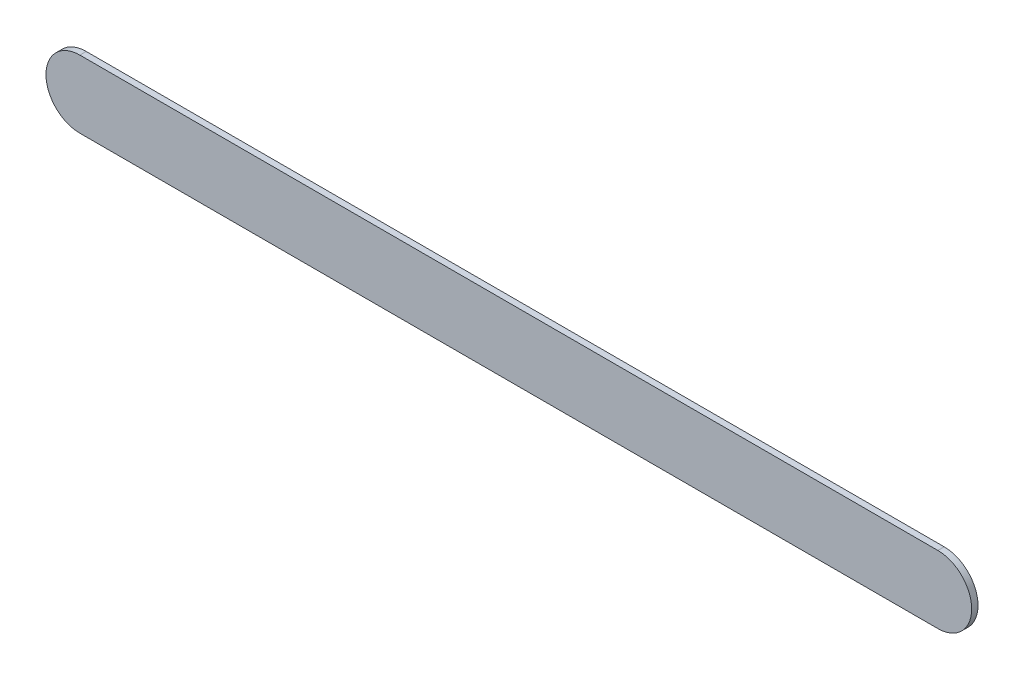
ISO-10303-21;
HEADER;
FILE_DESCRIPTION(('STEP AP214'),'2;1');
FILE_NAME('part.step','',(''),(''),'','','');
FILE_SCHEMA(('AUTOMOTIVE_DESIGN { 1 0 10303 214 1 1 1 1 }'));
ENDSEC;
DATA;
#1=APPLICATION_CONTEXT('core data for automotive mechanical design processes');
#2=APPLICATION_PROTOCOL_DEFINITION('international standard','automotive_design',2000,#1);
#3=PRODUCT_CONTEXT('',#1,'mechanical');
#4=PRODUCT('Part','Part','',(#3));
#5=PRODUCT_RELATED_PRODUCT_CATEGORY('part','',(#4));
#6=PRODUCT_DEFINITION_FORMATION('','',#4);
#7=PRODUCT_DEFINITION_CONTEXT('part definition',#1,'design');
#8=PRODUCT_DEFINITION('design','',#6,#7);
#9=PRODUCT_DEFINITION_SHAPE('','',#8);
#10=(LENGTH_UNIT() NAMED_UNIT(*) SI_UNIT(.MILLI.,.METRE.));
#11=(NAMED_UNIT(*) PLANE_ANGLE_UNIT() SI_UNIT($,.RADIAN.));
#12=(NAMED_UNIT(*) SI_UNIT($,.STERADIAN.) SOLID_ANGLE_UNIT());
#13=UNCERTAINTY_MEASURE_WITH_UNIT(LENGTH_MEASURE(1.E-05),#10,'distance_accuracy_value','');
#14=(GEOMETRIC_REPRESENTATION_CONTEXT(3) GLOBAL_UNCERTAINTY_ASSIGNED_CONTEXT((#13)) GLOBAL_UNIT_ASSIGNED_CONTEXT((#10,
#11,#12)) REPRESENTATION_CONTEXT('',''));
#15=CARTESIAN_POINT('',(0.,0.,0.));
#16=DIRECTION('',(0.,0.,1.));
#17=DIRECTION('',(1.,0.,0.));
#18=AXIS2_PLACEMENT_3D('',#15,#16,#17);
#19=CARTESIAN_POINT('',(24.5069995,11.1125,0.));
#20=DIRECTION('',(0.,1.,0.));
#21=DIRECTION('',(1.,0.,0.));
#22=AXIS2_PLACEMENT_3D('',#19,#20,#21);
#23=PLANE('',#22);
#24=DIRECTION('',(1.,0.,0.));
#25=VECTOR('',#24,1.);
#26=CARTESIAN_POINT('',(24.5069995,11.1125,0.03556));
#27=LINE('',#26,#25);
#28=CARTESIAN_POINT('',(24.5069995,11.1125,0.03556));
#29=VERTEX_POINT('',#28);
#30=CARTESIAN_POINT('',(29.337,11.1125,0.03556));
#31=VERTEX_POINT('',#30);
#32=EDGE_CURVE('E11',#29,#31,#27,.T.);
#33=ORIENTED_EDGE('',*,*,#32,.F.);
#34=DIRECTION('',(0.,0.,1.));
#35=VECTOR('',#34,1.);
#36=CARTESIAN_POINT('',(24.5069995,11.1125,0.));
#37=LINE('',#36,#35);
#38=CARTESIAN_POINT('',(24.5069995,11.1125,0.));
#39=VERTEX_POINT('',#38);
#40=EDGE_CURVE('E23',#39,#29,#37,.T.);
#41=ORIENTED_EDGE('',*,*,#40,.F.);
#42=DIRECTION('',(1.,0.,0.));
#43=VECTOR('',#42,1.);
#44=CARTESIAN_POINT('',(24.5069995,11.1125,0.));
#45=LINE('',#44,#43);
#46=CARTESIAN_POINT('',(29.337,11.1125,0.));
#47=VERTEX_POINT('',#46);
#48=EDGE_CURVE('E74',#39,#47,#45,.T.);
#49=ORIENTED_EDGE('',*,*,#48,.T.);
#50=DIRECTION('',(0.,0.,1.));
#51=VECTOR('',#50,1.);
#52=CARTESIAN_POINT('',(29.337,11.1125,0.));
#53=LINE('',#52,#51);
#54=EDGE_CURVE('E36',#47,#31,#53,.T.);
#55=ORIENTED_EDGE('',*,*,#54,.T.);
#56=EDGE_LOOP('',(#33,#41,#49,#55));
#57=FACE_BOUND('',#56,.T.);
#58=ADVANCED_FACE('F16',(#57),#23,.F.);
#59=CARTESIAN_POINT('',(29.337,11.303,0.));
#60=DIRECTION('',(0.,0.,-1.));
#61=DIRECTION('',(0.,-1.,0.));
#62=AXIS2_PLACEMENT_3D('',#59,#60,#61);
#63=CYLINDRICAL_SURFACE('',#62,0.1905);
#64=CARTESIAN_POINT('',(29.337,11.303,0.03556));
#65=DIRECTION('',(0.,0.,1.));
#66=DIRECTION('',(0.,-1.,0.));
#67=AXIS2_PLACEMENT_3D('',#64,#65,#66);
#68=CIRCLE('',#67,0.1905);
#69=CARTESIAN_POINT('',(29.337,11.4935,0.03556));
#70=VERTEX_POINT('',#69);
#71=EDGE_CURVE('E82',#31,#70,#68,.T.);
#72=ORIENTED_EDGE('',*,*,#71,.F.);
#73=ORIENTED_EDGE('',*,*,#54,.F.);
#74=CARTESIAN_POINT('',(29.337,11.303,0.));
#75=DIRECTION('',(0.,0.,1.));
#76=DIRECTION('',(0.,-1.,0.));
#77=AXIS2_PLACEMENT_3D('',#74,#75,#76);
#78=CIRCLE('',#77,0.1905);
#79=CARTESIAN_POINT('',(29.337,11.4935,0.));
#80=VERTEX_POINT('',#79);
#81=EDGE_CURVE('E80',#47,#80,#78,.T.);
#82=ORIENTED_EDGE('',*,*,#81,.T.);
#83=DIRECTION('',(0.,0.,1.));
#84=VECTOR('',#83,1.);
#85=CARTESIAN_POINT('',(29.337,11.4935,0.));
#86=LINE('',#85,#84);
#87=EDGE_CURVE('E66',#80,#70,#86,.T.);
#88=ORIENTED_EDGE('',*,*,#87,.T.);
#89=EDGE_LOOP('',(#72,#73,#82,#88));
#90=FACE_BOUND('',#89,.T.);
#91=ADVANCED_FACE('F88',(#90),#63,.T.);
#92=CARTESIAN_POINT('',(29.337,11.4935,0.));
#93=DIRECTION('',(0.,-1.,0.));
#94=DIRECTION('',(-1.,0.,0.));
#95=AXIS2_PLACEMENT_3D('',#92,#93,#94);
#96=PLANE('',#95);
#97=DIRECTION('',(-1.,0.,0.));
#98=VECTOR('',#97,1.);
#99=CARTESIAN_POINT('',(29.337,11.4935,0.03556));
#100=LINE('',#99,#98);
#101=CARTESIAN_POINT('',(24.5069995,11.4935,0.03556));
#102=VERTEX_POINT('',#101);
#103=EDGE_CURVE('E70',#70,#102,#100,.T.);
#104=ORIENTED_EDGE('',*,*,#103,.F.);
#105=ORIENTED_EDGE('',*,*,#87,.F.);
#106=DIRECTION('',(-1.,0.,0.));
#107=VECTOR('',#106,1.);
#108=CARTESIAN_POINT('',(29.337,11.4935,0.));
#109=LINE('',#108,#107);
#110=CARTESIAN_POINT('',(24.5069995,11.4935,0.));
#111=VERTEX_POINT('',#110);
#112=EDGE_CURVE('E62',#80,#111,#109,.T.);
#113=ORIENTED_EDGE('',*,*,#112,.T.);
#114=DIRECTION('',(0.,0.,1.));
#115=VECTOR('',#114,1.);
#116=CARTESIAN_POINT('',(24.5069995,11.4935,0.));
#117=LINE('',#116,#115);
#118=EDGE_CURVE('E52',#111,#102,#117,.T.);
#119=ORIENTED_EDGE('',*,*,#118,.T.);
#120=EDGE_LOOP('',(#104,#105,#113,#119));
#121=FACE_BOUND('',#120,.T.);
#122=ADVANCED_FACE('F65',(#121),#96,.F.);
#123=CARTESIAN_POINT('',(24.5069995,11.303,0.));
#124=DIRECTION('',(0.,0.,-1.));
#125=DIRECTION('',(0.,1.,0.));
#126=AXIS2_PLACEMENT_3D('',#123,#124,#125);
#127=CYLINDRICAL_SURFACE('',#126,0.1905);
#128=CARTESIAN_POINT('',(24.5069995,11.303,0.03556));
#129=DIRECTION('',(0.,0.,1.));
#130=DIRECTION('',(0.,1.,0.));
#131=AXIS2_PLACEMENT_3D('',#128,#129,#130);
#132=CIRCLE('',#131,0.1905);
#133=EDGE_CURVE('E58',#102,#29,#132,.T.);
#134=ORIENTED_EDGE('',*,*,#133,.F.);
#135=ORIENTED_EDGE('',*,*,#118,.F.);
#136=CARTESIAN_POINT('',(24.5069995,11.303,0.));
#137=DIRECTION('',(0.,0.,1.));
#138=DIRECTION('',(0.,1.,0.));
#139=AXIS2_PLACEMENT_3D('',#136,#137,#138);
#140=CIRCLE('',#139,0.1905);
#141=EDGE_CURVE('E56',#111,#39,#140,.T.);
#142=ORIENTED_EDGE('',*,*,#141,.T.);
#143=ORIENTED_EDGE('',*,*,#40,.T.);
#144=EDGE_LOOP('',(#134,#135,#142,#143));
#145=FACE_BOUND('',#144,.T.);
#146=ADVANCED_FACE('F54',(#145),#127,.T.);
#147=CARTESIAN_POINT('',(26.92199975,11.303,0.));
#148=DIRECTION('',(0.,0.,1.));
#149=DIRECTION('',(1.,0.,0.));
#150=AXIS2_PLACEMENT_3D('',#147,#148,#149);
#151=PLANE('',#150);
#152=ORIENTED_EDGE('',*,*,#141,.F.);
#153=ORIENTED_EDGE('',*,*,#112,.F.);
#154=ORIENTED_EDGE('',*,*,#81,.F.);
#155=ORIENTED_EDGE('',*,*,#48,.F.);
#156=EDGE_LOOP('',(#152,#153,#154,#155));
#157=FACE_BOUND('',#156,.T.);
#158=ADVANCED_FACE('F73',(#157),#151,.F.);
#159=CARTESIAN_POINT('',(26.92199975,11.303,0.03556));
#160=DIRECTION('',(0.,0.,1.));
#161=DIRECTION('',(1.,0.,0.));
#162=AXIS2_PLACEMENT_3D('',#159,#160,#161);
#163=PLANE('',#162);
#164=ORIENTED_EDGE('',*,*,#32,.T.);
#165=ORIENTED_EDGE('',*,*,#71,.T.);
#166=ORIENTED_EDGE('',*,*,#103,.T.);
#167=ORIENTED_EDGE('',*,*,#133,.T.);
#168=EDGE_LOOP('',(#164,#165,#166,#167));
#169=FACE_BOUND('',#168,.T.);
#170=ADVANCED_FACE('F90',(#169),#163,.T.);
#171=CLOSED_SHELL('',(#58,#91,#122,#146,#158,#170));
#172=MANIFOLD_SOLID_BREP('B1',#171);
#173=ADVANCED_BREP_SHAPE_REPRESENTATION('',(#18,#172),#14);
#174=SHAPE_DEFINITION_REPRESENTATION(#9,#173);
ENDSEC;
END-ISO-10303-21;
